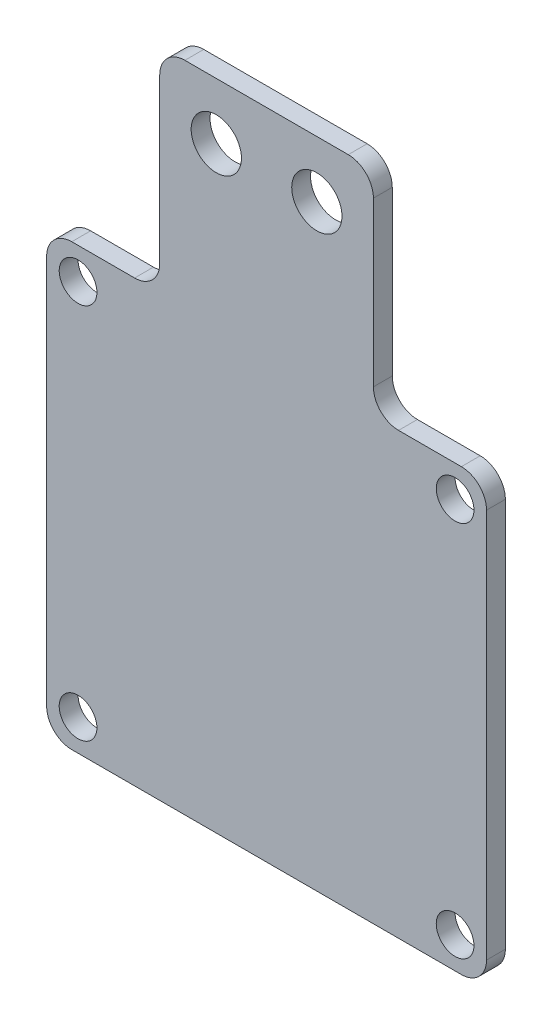
ISO-10303-21;
HEADER;
FILE_DESCRIPTION(('STEP AP214'),'2;1');
FILE_NAME('part.step','',(''),(''),'','','');
FILE_SCHEMA(('AUTOMOTIVE_DESIGN { 1 0 10303 214 1 1 1 1 }'));
ENDSEC;
DATA;
#1=APPLICATION_CONTEXT('core data for automotive mechanical design processes');
#2=APPLICATION_PROTOCOL_DEFINITION('international standard','automotive_design',2000,#1);
#3=PRODUCT_CONTEXT('',#1,'mechanical');
#4=PRODUCT('Part','Part','',(#3));
#5=PRODUCT_RELATED_PRODUCT_CATEGORY('part','',(#4));
#6=PRODUCT_DEFINITION_FORMATION('','',#4);
#7=PRODUCT_DEFINITION_CONTEXT('part definition',#1,'design');
#8=PRODUCT_DEFINITION('design','',#6,#7);
#9=PRODUCT_DEFINITION_SHAPE('','',#8);
#10=(LENGTH_UNIT() NAMED_UNIT(*) SI_UNIT(.MILLI.,.METRE.));
#11=(NAMED_UNIT(*) PLANE_ANGLE_UNIT() SI_UNIT($,.RADIAN.));
#12=(NAMED_UNIT(*) SI_UNIT($,.STERADIAN.) SOLID_ANGLE_UNIT());
#13=UNCERTAINTY_MEASURE_WITH_UNIT(LENGTH_MEASURE(1.E-05),#10,'distance_accuracy_value','');
#14=(GEOMETRIC_REPRESENTATION_CONTEXT(3) GLOBAL_UNCERTAINTY_ASSIGNED_CONTEXT((#13)) GLOBAL_UNIT_ASSIGNED_CONTEXT((#10,
#11,#12)) REPRESENTATION_CONTEXT('',''));
#15=CARTESIAN_POINT('',(0.,0.,0.));
#16=DIRECTION('',(0.,0.,1.));
#17=DIRECTION('',(1.,0.,0.));
#18=AXIS2_PLACEMENT_3D('',#15,#16,#17);
#19=CARTESIAN_POINT('',(10.5,37.,1.5));
#20=DIRECTION('',(0.,0.,1.));
#21=DIRECTION('',(1.,0.,0.));
#22=AXIS2_PLACEMENT_3D('',#19,#20,#21);
#23=PLANE('',#22);
#24=CARTESIAN_POINT('',(15.,32.5,1.5));
#25=DIRECTION('',(0.,0.,1.));
#26=DIRECTION('',(-1.,0.,0.));
#27=AXIS2_PLACEMENT_3D('',#24,#25,#26);
#28=CIRCLE('',#27,1.5);
#29=CARTESIAN_POINT('',(13.5,32.5,1.5));
#30=VERTEX_POINT('',#29);
#31=EDGE_CURVE('E353',#30,#30,#28,.T.);
#32=ORIENTED_EDGE('',*,*,#31,.F.);
#33=EDGE_LOOP('',(#32));
#34=FACE_BOUND('',#33,.T.);
#35=CARTESIAN_POINT('',(-4.,47.5,1.5));
#36=DIRECTION('',(0.,0.,1.));
#37=DIRECTION('',(1.,0.,0.));
#38=AXIS2_PLACEMENT_3D('',#35,#36,#37);
#39=CIRCLE('',#38,2.);
#40=CARTESIAN_POINT('',(-1.99999999999999,47.5,1.5));
#41=VERTEX_POINT('',#40);
#42=EDGE_CURVE('E365',#41,#41,#39,.T.);
#43=ORIENTED_EDGE('',*,*,#42,.F.);
#44=EDGE_LOOP('',(#43));
#45=FACE_BOUND('',#44,.T.);
#46=CARTESIAN_POINT('',(-15.,2.5,1.5));
#47=DIRECTION('',(0.,0.,1.));
#48=DIRECTION('',(1.,0.,0.));
#49=AXIS2_PLACEMENT_3D('',#46,#47,#48);
#50=CIRCLE('',#49,1.5);
#51=CARTESIAN_POINT('',(-13.5,2.5,1.5));
#52=VERTEX_POINT('',#51);
#53=EDGE_CURVE('E184',#52,#52,#50,.T.);
#54=ORIENTED_EDGE('',*,*,#53,.F.);
#55=EDGE_LOOP('',(#54));
#56=FACE_BOUND('',#55,.T.);
#57=CARTESIAN_POINT('',(10.5,37.,1.5));
#58=DIRECTION('',(0.,0.,-1.));
#59=DIRECTION('',(1.,0.,0.));
#60=AXIS2_PLACEMENT_3D('',#57,#58,#59);
#61=CIRCLE('',#60,2.);
#62=CARTESIAN_POINT('',(10.5,35.,1.5));
#63=VERTEX_POINT('',#62);
#64=CARTESIAN_POINT('',(8.5,37.,1.5));
#65=VERTEX_POINT('',#64);
#66=EDGE_CURVE('E213',#63,#65,#61,.T.);
#67=ORIENTED_EDGE('',*,*,#66,.T.);
#68=DIRECTION('',(0.,1.,0.));
#69=VECTOR('',#68,1.);
#70=CARTESIAN_POINT('',(8.5,37.,1.5));
#71=LINE('',#70,#69);
#72=CARTESIAN_POINT('',(8.5,50.,1.5));
#73=VERTEX_POINT('',#72);
#74=EDGE_CURVE('E119',#65,#73,#71,.T.);
#75=ORIENTED_EDGE('',*,*,#74,.T.);
#76=CARTESIAN_POINT('',(6.5,50.,1.5));
#77=DIRECTION('',(0.,0.,1.));
#78=DIRECTION('',(1.,0.,0.));
#79=AXIS2_PLACEMENT_3D('',#76,#77,#78);
#80=CIRCLE('',#79,2.);
#81=CARTESIAN_POINT('',(6.5,52.,1.5));
#82=VERTEX_POINT('',#81);
#83=EDGE_CURVE('E252',#73,#82,#80,.T.);
#84=ORIENTED_EDGE('',*,*,#83,.T.);
#85=DIRECTION('',(-1.,0.,0.));
#86=VECTOR('',#85,1.);
#87=CARTESIAN_POINT('',(6.5,52.,1.5));
#88=LINE('',#87,#86);
#89=CARTESIAN_POINT('',(-6.5,52.,1.5));
#90=VERTEX_POINT('',#89);
#91=EDGE_CURVE('E270',#82,#90,#88,.T.);
#92=ORIENTED_EDGE('',*,*,#91,.T.);
#93=CARTESIAN_POINT('',(-6.5,50.,1.5));
#94=DIRECTION('',(0.,0.,1.));
#95=DIRECTION('',(-1.,0.,0.));
#96=AXIS2_PLACEMENT_3D('',#93,#94,#95);
#97=CIRCLE('',#96,2.);
#98=CARTESIAN_POINT('',(-8.5,50.,1.5));
#99=VERTEX_POINT('',#98);
#100=EDGE_CURVE('E267',#90,#99,#97,.T.);
#101=ORIENTED_EDGE('',*,*,#100,.T.);
#102=DIRECTION('',(0.,-1.,0.));
#103=VECTOR('',#102,1.);
#104=CARTESIAN_POINT('',(-8.5,37.,1.5));
#105=LINE('',#104,#103);
#106=CARTESIAN_POINT('',(-8.5,37.,1.5));
#107=VERTEX_POINT('',#106);
#108=EDGE_CURVE('E269',#99,#107,#105,.T.);
#109=ORIENTED_EDGE('',*,*,#108,.T.);
#110=CARTESIAN_POINT('',(-10.5,37.,1.5));
#111=DIRECTION('',(0.,0.,-1.));
#112=DIRECTION('',(-1.,0.,0.));
#113=AXIS2_PLACEMENT_3D('',#110,#111,#112);
#114=CIRCLE('',#113,2.);
#115=CARTESIAN_POINT('',(-10.5,35.,1.5));
#116=VERTEX_POINT('',#115);
#117=EDGE_CURVE('E272',#107,#116,#114,.T.);
#118=ORIENTED_EDGE('',*,*,#117,.T.);
#119=DIRECTION('',(-1.,0.,0.));
#120=VECTOR('',#119,1.);
#121=CARTESIAN_POINT('',(-15.5,35.,1.5));
#122=LINE('',#121,#120);
#123=CARTESIAN_POINT('',(-15.5,35.,1.5));
#124=VERTEX_POINT('',#123);
#125=EDGE_CURVE('E278',#116,#124,#122,.T.);
#126=ORIENTED_EDGE('',*,*,#125,.T.);
#127=CARTESIAN_POINT('',(-15.5,33.,1.5));
#128=DIRECTION('',(0.,0.,1.));
#129=DIRECTION('',(-1.,0.,0.));
#130=AXIS2_PLACEMENT_3D('',#127,#128,#129);
#131=CIRCLE('',#130,2.);
#132=CARTESIAN_POINT('',(-17.5,33.,1.5));
#133=VERTEX_POINT('',#132);
#134=EDGE_CURVE('E280',#124,#133,#131,.T.);
#135=ORIENTED_EDGE('',*,*,#134,.T.);
#136=DIRECTION('',(0.,-1.,0.));
#137=VECTOR('',#136,1.);
#138=CARTESIAN_POINT('',(-17.5,2.,1.5));
#139=LINE('',#138,#137);
#140=CARTESIAN_POINT('',(-17.5,2.,1.5));
#141=VERTEX_POINT('',#140);
#142=EDGE_CURVE('E282',#133,#141,#139,.T.);
#143=ORIENTED_EDGE('',*,*,#142,.T.);
#144=CARTESIAN_POINT('',(-15.5,2.,1.5));
#145=DIRECTION('',(0.,0.,1.));
#146=DIRECTION('',(-1.,0.,0.));
#147=AXIS2_PLACEMENT_3D('',#144,#145,#146);
#148=CIRCLE('',#147,2.);
#149=CARTESIAN_POINT('',(-15.5,0.,1.5));
#150=VERTEX_POINT('',#149);
#151=EDGE_CURVE('E284',#141,#150,#148,.T.);
#152=ORIENTED_EDGE('',*,*,#151,.T.);
#153=DIRECTION('',(1.,0.,0.));
#154=VECTOR('',#153,1.);
#155=CARTESIAN_POINT('',(0.,0.,1.5));
#156=LINE('',#155,#154);
#157=CARTESIAN_POINT('',(15.5,0.,1.5));
#158=VERTEX_POINT('',#157);
#159=EDGE_CURVE('E286',#150,#158,#156,.T.);
#160=ORIENTED_EDGE('',*,*,#159,.T.);
#161=CARTESIAN_POINT('',(15.5,2.,1.5));
#162=DIRECTION('',(0.,0.,1.));
#163=DIRECTION('',(1.,0.,0.));
#164=AXIS2_PLACEMENT_3D('',#161,#162,#163);
#165=CIRCLE('',#164,2.);
#166=CARTESIAN_POINT('',(17.5,2.,1.5));
#167=VERTEX_POINT('',#166);
#168=EDGE_CURVE('E162',#158,#167,#165,.T.);
#169=ORIENTED_EDGE('',*,*,#168,.T.);
#170=DIRECTION('',(0.,1.,0.));
#171=VECTOR('',#170,1.);
#172=CARTESIAN_POINT('',(17.5,2.,1.5));
#173=LINE('',#172,#171);
#174=CARTESIAN_POINT('',(17.5,33.,1.5));
#175=VERTEX_POINT('',#174);
#176=EDGE_CURVE('E156',#167,#175,#173,.T.);
#177=ORIENTED_EDGE('',*,*,#176,.T.);
#178=CARTESIAN_POINT('',(15.5,33.,1.5));
#179=DIRECTION('',(0.,0.,1.));
#180=DIRECTION('',(1.,0.,0.));
#181=AXIS2_PLACEMENT_3D('',#178,#179,#180);
#182=CIRCLE('',#181,2.);
#183=CARTESIAN_POINT('',(15.5,35.,1.5));
#184=VERTEX_POINT('',#183);
#185=EDGE_CURVE('E160',#175,#184,#182,.T.);
#186=ORIENTED_EDGE('',*,*,#185,.T.);
#187=DIRECTION('',(-1.,0.,0.));
#188=VECTOR('',#187,1.);
#189=CARTESIAN_POINT('',(15.5,35.,1.5));
#190=LINE('',#189,#188);
#191=EDGE_CURVE('E52',#184,#63,#190,.T.);
#192=ORIENTED_EDGE('',*,*,#191,.T.);
#193=EDGE_LOOP('',(#67,#75,#84,#92,#101,#109,#118,#126,#135,#143,#152,#160,#169,#177,#186,#192));
#194=FACE_BOUND('',#193,.T.);
#195=CARTESIAN_POINT('',(-15.,32.5,1.5));
#196=DIRECTION('',(0.,0.,1.));
#197=DIRECTION('',(1.,0.,0.));
#198=AXIS2_PLACEMENT_3D('',#195,#196,#197);
#199=CIRCLE('',#198,1.5);
#200=CARTESIAN_POINT('',(-13.5,32.5,1.5));
#201=VERTEX_POINT('',#200);
#202=EDGE_CURVE('E371',#201,#201,#199,.T.);
#203=ORIENTED_EDGE('',*,*,#202,.F.);
#204=EDGE_LOOP('',(#203));
#205=FACE_BOUND('',#204,.T.);
#206=CARTESIAN_POINT('',(4.,47.5,1.5));
#207=DIRECTION('',(0.,0.,1.));
#208=DIRECTION('',(-1.,0.,0.));
#209=AXIS2_PLACEMENT_3D('',#206,#207,#208);
#210=CIRCLE('',#209,2.);
#211=CARTESIAN_POINT('',(1.99999999999999,47.5,1.5));
#212=VERTEX_POINT('',#211);
#213=EDGE_CURVE('E359',#212,#212,#210,.T.);
#214=ORIENTED_EDGE('',*,*,#213,.F.);
#215=EDGE_LOOP('',(#214));
#216=FACE_BOUND('',#215,.T.);
#217=CARTESIAN_POINT('',(15.,2.5,1.5));
#218=DIRECTION('',(0.,0.,1.));
#219=DIRECTION('',(-1.,0.,0.));
#220=AXIS2_PLACEMENT_3D('',#217,#218,#219);
#221=CIRCLE('',#220,1.5);
#222=CARTESIAN_POINT('',(13.5,2.5,1.5));
#223=VERTEX_POINT('',#222);
#224=EDGE_CURVE('E344',#223,#223,#221,.T.);
#225=ORIENTED_EDGE('',*,*,#224,.F.);
#226=EDGE_LOOP('',(#225));
#227=FACE_BOUND('',#226,.T.);
#228=ADVANCED_FACE('F35',(#34,#45,#56,#194,#205,#216,#227),#23,.T.);
#229=CARTESIAN_POINT('',(10.5,37.,0.));
#230=DIRECTION('',(0.,0.,1.));
#231=DIRECTION('',(1.,0.,0.));
#232=AXIS2_PLACEMENT_3D('',#229,#230,#231);
#233=PLANE('',#232);
#234=CARTESIAN_POINT('',(10.5,37.,0.));
#235=DIRECTION('',(0.,0.,-1.));
#236=DIRECTION('',(1.,0.,0.));
#237=AXIS2_PLACEMENT_3D('',#234,#235,#236);
#238=CIRCLE('',#237,2.);
#239=CARTESIAN_POINT('',(10.5,35.,0.));
#240=VERTEX_POINT('',#239);
#241=CARTESIAN_POINT('',(8.5,37.,0.));
#242=VERTEX_POINT('',#241);
#243=EDGE_CURVE('E180',#240,#242,#238,.T.);
#244=ORIENTED_EDGE('',*,*,#243,.F.);
#245=DIRECTION('',(-1.,0.,0.));
#246=VECTOR('',#245,1.);
#247=CARTESIAN_POINT('',(15.5,35.,0.));
#248=LINE('',#247,#246);
#249=CARTESIAN_POINT('',(15.5,35.,0.));
#250=VERTEX_POINT('',#249);
#251=EDGE_CURVE('E111',#250,#240,#248,.T.);
#252=ORIENTED_EDGE('',*,*,#251,.F.);
#253=CARTESIAN_POINT('',(15.5,33.,0.));
#254=DIRECTION('',(0.,0.,1.));
#255=DIRECTION('',(1.,0.,0.));
#256=AXIS2_PLACEMENT_3D('',#253,#254,#255);
#257=CIRCLE('',#256,2.);
#258=CARTESIAN_POINT('',(17.5,33.,0.));
#259=VERTEX_POINT('',#258);
#260=EDGE_CURVE('E105',#259,#250,#257,.T.);
#261=ORIENTED_EDGE('',*,*,#260,.F.);
#262=DIRECTION('',(0.,1.,0.));
#263=VECTOR('',#262,1.);
#264=CARTESIAN_POINT('',(17.5,2.,0.));
#265=LINE('',#264,#263);
#266=CARTESIAN_POINT('',(17.5,2.,0.));
#267=VERTEX_POINT('',#266);
#268=EDGE_CURVE('E170',#267,#259,#265,.T.);
#269=ORIENTED_EDGE('',*,*,#268,.F.);
#270=CARTESIAN_POINT('',(15.5,2.,0.));
#271=DIRECTION('',(0.,0.,1.));
#272=DIRECTION('',(1.,0.,0.));
#273=AXIS2_PLACEMENT_3D('',#270,#271,#272);
#274=CIRCLE('',#273,2.);
#275=CARTESIAN_POINT('',(15.5,0.,0.));
#276=VERTEX_POINT('',#275);
#277=EDGE_CURVE('E208',#276,#267,#274,.T.);
#278=ORIENTED_EDGE('',*,*,#277,.F.);
#279=DIRECTION('',(1.,0.,0.));
#280=VECTOR('',#279,1.);
#281=CARTESIAN_POINT('',(0.,0.,0.));
#282=LINE('',#281,#280);
#283=CARTESIAN_POINT('',(-15.5,0.,0.));
#284=VERTEX_POINT('',#283);
#285=EDGE_CURVE('E206',#284,#276,#282,.T.);
#286=ORIENTED_EDGE('',*,*,#285,.F.);
#287=CARTESIAN_POINT('',(-15.5,2.,0.));
#288=DIRECTION('',(0.,0.,1.));
#289=DIRECTION('',(-1.,0.,0.));
#290=AXIS2_PLACEMENT_3D('',#287,#288,#289);
#291=CIRCLE('',#290,2.);
#292=CARTESIAN_POINT('',(-17.5,2.,0.));
#293=VERTEX_POINT('',#292);
#294=EDGE_CURVE('E203',#293,#284,#291,.T.);
#295=ORIENTED_EDGE('',*,*,#294,.F.);
#296=DIRECTION('',(0.,-1.,0.));
#297=VECTOR('',#296,1.);
#298=CARTESIAN_POINT('',(-17.5,2.,0.));
#299=LINE('',#298,#297);
#300=CARTESIAN_POINT('',(-17.5,33.,0.));
#301=VERTEX_POINT('',#300);
#302=EDGE_CURVE('E201',#301,#293,#299,.T.);
#303=ORIENTED_EDGE('',*,*,#302,.F.);
#304=CARTESIAN_POINT('',(-15.5,33.,0.));
#305=DIRECTION('',(0.,0.,1.));
#306=DIRECTION('',(-1.,0.,0.));
#307=AXIS2_PLACEMENT_3D('',#304,#305,#306);
#308=CIRCLE('',#307,2.);
#309=CARTESIAN_POINT('',(-15.5,35.,0.));
#310=VERTEX_POINT('',#309);
#311=EDGE_CURVE('E199',#310,#301,#308,.T.);
#312=ORIENTED_EDGE('',*,*,#311,.F.);
#313=DIRECTION('',(-1.,0.,0.));
#314=VECTOR('',#313,1.);
#315=CARTESIAN_POINT('',(-15.5,35.,0.));
#316=LINE('',#315,#314);
#317=CARTESIAN_POINT('',(-10.5,35.,0.));
#318=VERTEX_POINT('',#317);
#319=EDGE_CURVE('E197',#318,#310,#316,.T.);
#320=ORIENTED_EDGE('',*,*,#319,.F.);
#321=CARTESIAN_POINT('',(-10.5,37.,0.));
#322=DIRECTION('',(0.,0.,-1.));
#323=DIRECTION('',(-1.,0.,0.));
#324=AXIS2_PLACEMENT_3D('',#321,#322,#323);
#325=CIRCLE('',#324,2.);
#326=CARTESIAN_POINT('',(-8.5,37.,0.));
#327=VERTEX_POINT('',#326);
#328=EDGE_CURVE('E195',#327,#318,#325,.T.);
#329=ORIENTED_EDGE('',*,*,#328,.F.);
#330=DIRECTION('',(0.,-1.,0.));
#331=VECTOR('',#330,1.);
#332=CARTESIAN_POINT('',(-8.5,37.,0.));
#333=LINE('',#332,#331);
#334=CARTESIAN_POINT('',(-8.5,50.,0.));
#335=VERTEX_POINT('',#334);
#336=EDGE_CURVE('E193',#335,#327,#333,.T.);
#337=ORIENTED_EDGE('',*,*,#336,.F.);
#338=CARTESIAN_POINT('',(-6.5,50.,0.));
#339=DIRECTION('',(0.,0.,1.));
#340=DIRECTION('',(-1.,0.,0.));
#341=AXIS2_PLACEMENT_3D('',#338,#339,#340);
#342=CIRCLE('',#341,2.);
#343=CARTESIAN_POINT('',(-6.5,52.,0.));
#344=VERTEX_POINT('',#343);
#345=EDGE_CURVE('E191',#344,#335,#342,.T.);
#346=ORIENTED_EDGE('',*,*,#345,.F.);
#347=DIRECTION('',(-1.,0.,0.));
#348=VECTOR('',#347,1.);
#349=CARTESIAN_POINT('',(-6.5,52.,0.));
#350=LINE('',#349,#348);
#351=CARTESIAN_POINT('',(6.5,52.,0.));
#352=VERTEX_POINT('',#351);
#353=EDGE_CURVE('E189',#352,#344,#350,.T.);
#354=ORIENTED_EDGE('',*,*,#353,.F.);
#355=CARTESIAN_POINT('',(6.5,50.,0.));
#356=DIRECTION('',(0.,0.,1.));
#357=DIRECTION('',(1.,0.,0.));
#358=AXIS2_PLACEMENT_3D('',#355,#356,#357);
#359=CIRCLE('',#358,2.);
#360=CARTESIAN_POINT('',(8.5,50.,0.));
#361=VERTEX_POINT('',#360);
#362=EDGE_CURVE('E186',#361,#352,#359,.T.);
#363=ORIENTED_EDGE('',*,*,#362,.F.);
#364=DIRECTION('',(0.,1.,0.));
#365=VECTOR('',#364,1.);
#366=CARTESIAN_POINT('',(8.5,37.,0.));
#367=LINE('',#366,#365);
#368=EDGE_CURVE('E183',#242,#361,#367,.T.);
#369=ORIENTED_EDGE('',*,*,#368,.F.);
#370=EDGE_LOOP('',(#244,#252,#261,#269,#278,#286,#295,#303,#312,#320,#329,#337,#346,#354,#363,#369));
#371=FACE_BOUND('',#370,.T.);
#372=CARTESIAN_POINT('',(-15.,2.5,0.));
#373=DIRECTION('',(0.,0.,1.));
#374=DIRECTION('',(1.,0.,0.));
#375=AXIS2_PLACEMENT_3D('',#372,#373,#374);
#376=CIRCLE('',#375,1.5);
#377=CARTESIAN_POINT('',(-13.5,2.5,0.));
#378=VERTEX_POINT('',#377);
#379=EDGE_CURVE('E374',#378,#378,#376,.T.);
#380=ORIENTED_EDGE('',*,*,#379,.T.);
#381=EDGE_LOOP('',(#380));
#382=FACE_BOUND('',#381,.T.);
#383=CARTESIAN_POINT('',(-15.,32.5,0.));
#384=DIRECTION('',(0.,0.,1.));
#385=DIRECTION('',(1.,0.,0.));
#386=AXIS2_PLACEMENT_3D('',#383,#384,#385);
#387=CIRCLE('',#386,1.5);
#388=CARTESIAN_POINT('',(-13.5,32.5,0.));
#389=VERTEX_POINT('',#388);
#390=EDGE_CURVE('E368',#389,#389,#387,.T.);
#391=ORIENTED_EDGE('',*,*,#390,.T.);
#392=EDGE_LOOP('',(#391));
#393=FACE_BOUND('',#392,.T.);
#394=CARTESIAN_POINT('',(-4.,47.5,0.));
#395=DIRECTION('',(0.,0.,1.));
#396=DIRECTION('',(1.,0.,0.));
#397=AXIS2_PLACEMENT_3D('',#394,#395,#396);
#398=CIRCLE('',#397,2.);
#399=CARTESIAN_POINT('',(-1.99999999999999,47.5,0.));
#400=VERTEX_POINT('',#399);
#401=EDGE_CURVE('E362',#400,#400,#398,.T.);
#402=ORIENTED_EDGE('',*,*,#401,.T.);
#403=EDGE_LOOP('',(#402));
#404=FACE_BOUND('',#403,.T.);
#405=CARTESIAN_POINT('',(4.,47.5,0.));
#406=DIRECTION('',(0.,0.,1.));
#407=DIRECTION('',(-1.,0.,0.));
#408=AXIS2_PLACEMENT_3D('',#405,#406,#407);
#409=CIRCLE('',#408,2.);
#410=CARTESIAN_POINT('',(1.99999999999999,47.5,0.));
#411=VERTEX_POINT('',#410);
#412=EDGE_CURVE('E356',#411,#411,#409,.T.);
#413=ORIENTED_EDGE('',*,*,#412,.T.);
#414=EDGE_LOOP('',(#413));
#415=FACE_BOUND('',#414,.T.);
#416=CARTESIAN_POINT('',(15.,32.5,0.));
#417=DIRECTION('',(0.,0.,1.));
#418=DIRECTION('',(-1.,0.,0.));
#419=AXIS2_PLACEMENT_3D('',#416,#417,#418);
#420=CIRCLE('',#419,1.5);
#421=CARTESIAN_POINT('',(13.5,32.5,0.));
#422=VERTEX_POINT('',#421);
#423=EDGE_CURVE('E350',#422,#422,#420,.T.);
#424=ORIENTED_EDGE('',*,*,#423,.T.);
#425=EDGE_LOOP('',(#424));
#426=FACE_BOUND('',#425,.T.);
#427=CARTESIAN_POINT('',(15.,2.5,0.));
#428=DIRECTION('',(0.,0.,1.));
#429=DIRECTION('',(-1.,0.,0.));
#430=AXIS2_PLACEMENT_3D('',#427,#428,#429);
#431=CIRCLE('',#430,1.5);
#432=CARTESIAN_POINT('',(13.5,2.5,0.));
#433=VERTEX_POINT('',#432);
#434=EDGE_CURVE('E347',#433,#433,#431,.T.);
#435=ORIENTED_EDGE('',*,*,#434,.T.);
#436=EDGE_LOOP('',(#435));
#437=FACE_BOUND('',#436,.T.);
#438=ADVANCED_FACE('F255',(#371,#382,#393,#404,#415,#426,#437),#233,.F.);
#439=CARTESIAN_POINT('',(10.5,37.,1.5));
#440=DIRECTION('',(0.,0.,-1.));
#441=DIRECTION('',(-1.,0.,0.));
#442=AXIS2_PLACEMENT_3D('',#439,#440,#441);
#443=CYLINDRICAL_SURFACE('',#442,2.);
#444=ORIENTED_EDGE('',*,*,#243,.T.);
#445=DIRECTION('',(0.,0.,-1.));
#446=VECTOR('',#445,1.);
#447=CARTESIAN_POINT('',(8.5,37.,1.5));
#448=LINE('',#447,#446);
#449=EDGE_CURVE('E11',#65,#242,#448,.T.);
#450=ORIENTED_EDGE('',*,*,#449,.F.);
#451=ORIENTED_EDGE('',*,*,#66,.F.);
#452=DIRECTION('',(0.,0.,-1.));
#453=VECTOR('',#452,1.);
#454=CARTESIAN_POINT('',(10.5,35.,1.5));
#455=LINE('',#454,#453);
#456=EDGE_CURVE('E176',#63,#240,#455,.T.);
#457=ORIENTED_EDGE('',*,*,#456,.T.);
#458=EDGE_LOOP('',(#444,#450,#451,#457));
#459=FACE_BOUND('',#458,.T.);
#460=ADVANCED_FACE('F37',(#459),#443,.F.);
#461=CARTESIAN_POINT('',(8.5,37.,1.5));
#462=DIRECTION('',(-1.,0.,0.));
#463=DIRECTION('',(0.,-1.,0.));
#464=AXIS2_PLACEMENT_3D('',#461,#462,#463);
#465=PLANE('',#464);
#466=ORIENTED_EDGE('',*,*,#368,.T.);
#467=DIRECTION('',(0.,0.,-1.));
#468=VECTOR('',#467,1.);
#469=CARTESIAN_POINT('',(8.5,50.,1.5));
#470=LINE('',#469,#468);
#471=EDGE_CURVE('E44',#73,#361,#470,.T.);
#472=ORIENTED_EDGE('',*,*,#471,.F.);
#473=ORIENTED_EDGE('',*,*,#74,.F.);
#474=ORIENTED_EDGE('',*,*,#449,.T.);
#475=EDGE_LOOP('',(#466,#472,#473,#474));
#476=FACE_BOUND('',#475,.T.);
#477=ADVANCED_FACE('F544',(#476),#465,.F.);
#478=CARTESIAN_POINT('',(6.5,50.,1.5));
#479=DIRECTION('',(0.,0.,-1.));
#480=DIRECTION('',(-1.,0.,0.));
#481=AXIS2_PLACEMENT_3D('',#478,#479,#480);
#482=CYLINDRICAL_SURFACE('',#481,2.);
#483=ORIENTED_EDGE('',*,*,#362,.T.);
#484=DIRECTION('',(0.,0.,-1.));
#485=VECTOR('',#484,1.);
#486=CARTESIAN_POINT('',(6.5,52.,1.5));
#487=LINE('',#486,#485);
#488=EDGE_CURVE('E244',#82,#352,#487,.T.);
#489=ORIENTED_EDGE('',*,*,#488,.F.);
#490=ORIENTED_EDGE('',*,*,#83,.F.);
#491=ORIENTED_EDGE('',*,*,#471,.T.);
#492=EDGE_LOOP('',(#483,#489,#490,#491));
#493=FACE_BOUND('',#492,.T.);
#494=ADVANCED_FACE('F250',(#493),#482,.T.);
#495=CARTESIAN_POINT('',(-6.5,52.,1.5));
#496=DIRECTION('',(0.,-1.,0.));
#497=DIRECTION('',(1.,0.,0.));
#498=AXIS2_PLACEMENT_3D('',#495,#496,#497);
#499=PLANE('',#498);
#500=ORIENTED_EDGE('',*,*,#353,.T.);
#501=DIRECTION('',(0.,0.,-1.));
#502=VECTOR('',#501,1.);
#503=CARTESIAN_POINT('',(-6.5,52.,1.5));
#504=LINE('',#503,#502);
#505=EDGE_CURVE('E241',#90,#344,#504,.T.);
#506=ORIENTED_EDGE('',*,*,#505,.F.);
#507=ORIENTED_EDGE('',*,*,#91,.F.);
#508=ORIENTED_EDGE('',*,*,#488,.T.);
#509=EDGE_LOOP('',(#500,#506,#507,#508));
#510=FACE_BOUND('',#509,.T.);
#511=ADVANCED_FACE('F261',(#510),#499,.F.);
#512=CARTESIAN_POINT('',(-6.5,50.,1.5));
#513=DIRECTION('',(0.,0.,-1.));
#514=DIRECTION('',(-1.,0.,0.));
#515=AXIS2_PLACEMENT_3D('',#512,#513,#514);
#516=CYLINDRICAL_SURFACE('',#515,2.);
#517=ORIENTED_EDGE('',*,*,#345,.T.);
#518=DIRECTION('',(0.,0.,-1.));
#519=VECTOR('',#518,1.);
#520=CARTESIAN_POINT('',(-8.5,50.,1.5));
#521=LINE('',#520,#519);
#522=EDGE_CURVE('E238',#99,#335,#521,.T.);
#523=ORIENTED_EDGE('',*,*,#522,.F.);
#524=ORIENTED_EDGE('',*,*,#100,.F.);
#525=ORIENTED_EDGE('',*,*,#505,.T.);
#526=EDGE_LOOP('',(#517,#523,#524,#525));
#527=FACE_BOUND('',#526,.T.);
#528=ADVANCED_FACE('F265',(#527),#516,.T.);
#529=CARTESIAN_POINT('',(-8.5,37.,1.5));
#530=DIRECTION('',(1.,0.,0.));
#531=DIRECTION('',(0.,1.,0.));
#532=AXIS2_PLACEMENT_3D('',#529,#530,#531);
#533=PLANE('',#532);
#534=ORIENTED_EDGE('',*,*,#336,.T.);
#535=DIRECTION('',(0.,0.,-1.));
#536=VECTOR('',#535,1.);
#537=CARTESIAN_POINT('',(-8.5,37.,1.5));
#538=LINE('',#537,#536);
#539=EDGE_CURVE('E235',#107,#327,#538,.T.);
#540=ORIENTED_EDGE('',*,*,#539,.F.);
#541=ORIENTED_EDGE('',*,*,#108,.F.);
#542=ORIENTED_EDGE('',*,*,#522,.T.);
#543=EDGE_LOOP('',(#534,#540,#541,#542));
#544=FACE_BOUND('',#543,.T.);
#545=ADVANCED_FACE('F508',(#544),#533,.F.);
#546=CARTESIAN_POINT('',(-10.5,37.,1.5));
#547=DIRECTION('',(0.,0.,-1.));
#548=DIRECTION('',(-1.,0.,0.));
#549=AXIS2_PLACEMENT_3D('',#546,#547,#548);
#550=CYLINDRICAL_SURFACE('',#549,2.);
#551=ORIENTED_EDGE('',*,*,#328,.T.);
#552=DIRECTION('',(0.,0.,-1.));
#553=VECTOR('',#552,1.);
#554=CARTESIAN_POINT('',(-10.5,35.,1.5));
#555=LINE('',#554,#553);
#556=EDGE_CURVE('E232',#116,#318,#555,.T.);
#557=ORIENTED_EDGE('',*,*,#556,.F.);
#558=ORIENTED_EDGE('',*,*,#117,.F.);
#559=ORIENTED_EDGE('',*,*,#539,.T.);
#560=EDGE_LOOP('',(#551,#557,#558,#559));
#561=FACE_BOUND('',#560,.T.);
#562=ADVANCED_FACE('F498',(#561),#550,.F.);
#563=CARTESIAN_POINT('',(-15.5,35.,1.5));
#564=DIRECTION('',(0.,-1.,0.));
#565=DIRECTION('',(0.,0.,-1.));
#566=AXIS2_PLACEMENT_3D('',#563,#564,#565);
#567=PLANE('',#566);
#568=ORIENTED_EDGE('',*,*,#319,.T.);
#569=DIRECTION('',(0.,0.,-1.));
#570=VECTOR('',#569,1.);
#571=CARTESIAN_POINT('',(-15.5,35.,1.5));
#572=LINE('',#571,#570);
#573=EDGE_CURVE('E229',#124,#310,#572,.T.);
#574=ORIENTED_EDGE('',*,*,#573,.F.);
#575=ORIENTED_EDGE('',*,*,#125,.F.);
#576=ORIENTED_EDGE('',*,*,#556,.T.);
#577=EDGE_LOOP('',(#568,#574,#575,#576));
#578=FACE_BOUND('',#577,.T.);
#579=ADVANCED_FACE('F488',(#578),#567,.F.);
#580=CARTESIAN_POINT('',(-15.5,33.,1.5));
#581=DIRECTION('',(0.,0.,-1.));
#582=DIRECTION('',(-1.,0.,0.));
#583=AXIS2_PLACEMENT_3D('',#580,#581,#582);
#584=CYLINDRICAL_SURFACE('',#583,2.);
#585=ORIENTED_EDGE('',*,*,#311,.T.);
#586=DIRECTION('',(0.,0.,-1.));
#587=VECTOR('',#586,1.);
#588=CARTESIAN_POINT('',(-17.5,33.,1.5));
#589=LINE('',#588,#587);
#590=EDGE_CURVE('E226',#133,#301,#589,.T.);
#591=ORIENTED_EDGE('',*,*,#590,.F.);
#592=ORIENTED_EDGE('',*,*,#134,.F.);
#593=ORIENTED_EDGE('',*,*,#573,.T.);
#594=EDGE_LOOP('',(#585,#591,#592,#593));
#595=FACE_BOUND('',#594,.T.);
#596=ADVANCED_FACE('F478',(#595),#584,.T.);
#597=CARTESIAN_POINT('',(-17.5,2.,1.5));
#598=DIRECTION('',(1.,0.,0.));
#599=DIRECTION('',(0.,0.,-1.));
#600=AXIS2_PLACEMENT_3D('',#597,#598,#599);
#601=PLANE('',#600);
#602=ORIENTED_EDGE('',*,*,#302,.T.);
#603=DIRECTION('',(0.,0.,-1.));
#604=VECTOR('',#603,1.);
#605=CARTESIAN_POINT('',(-17.5,2.,1.5));
#606=LINE('',#605,#604);
#607=EDGE_CURVE('E223',#141,#293,#606,.T.);
#608=ORIENTED_EDGE('',*,*,#607,.F.);
#609=ORIENTED_EDGE('',*,*,#142,.F.);
#610=ORIENTED_EDGE('',*,*,#590,.T.);
#611=EDGE_LOOP('',(#602,#608,#609,#610));
#612=FACE_BOUND('',#611,.T.);
#613=ADVANCED_FACE('F468',(#612),#601,.F.);
#614=CARTESIAN_POINT('',(-15.5,2.,1.5));
#615=DIRECTION('',(0.,0.,-1.));
#616=DIRECTION('',(-1.,0.,0.));
#617=AXIS2_PLACEMENT_3D('',#614,#615,#616);
#618=CYLINDRICAL_SURFACE('',#617,2.);
#619=ORIENTED_EDGE('',*,*,#294,.T.);
#620=DIRECTION('',(0.,0.,-1.));
#621=VECTOR('',#620,1.);
#622=CARTESIAN_POINT('',(-15.5,0.,1.5));
#623=LINE('',#622,#621);
#624=EDGE_CURVE('E220',#150,#284,#623,.T.);
#625=ORIENTED_EDGE('',*,*,#624,.F.);
#626=ORIENTED_EDGE('',*,*,#151,.F.);
#627=ORIENTED_EDGE('',*,*,#607,.T.);
#628=EDGE_LOOP('',(#619,#625,#626,#627));
#629=FACE_BOUND('',#628,.T.);
#630=ADVANCED_FACE('F458',(#629),#618,.T.);
#631=CARTESIAN_POINT('',(0.,0.,1.5));
#632=DIRECTION('',(0.,1.,0.));
#633=DIRECTION('',(-1.,0.,0.));
#634=AXIS2_PLACEMENT_3D('',#631,#632,#633);
#635=PLANE('',#634);
#636=ORIENTED_EDGE('',*,*,#285,.T.);
#637=DIRECTION('',(0.,0.,-1.));
#638=VECTOR('',#637,1.);
#639=CARTESIAN_POINT('',(15.5,0.,1.5));
#640=LINE('',#639,#638);
#641=EDGE_CURVE('E217',#158,#276,#640,.T.);
#642=ORIENTED_EDGE('',*,*,#641,.F.);
#643=ORIENTED_EDGE('',*,*,#159,.F.);
#644=ORIENTED_EDGE('',*,*,#624,.T.);
#645=EDGE_LOOP('',(#636,#642,#643,#644));
#646=FACE_BOUND('',#645,.T.);
#647=ADVANCED_FACE('F292',(#646),#635,.F.);
#648=CARTESIAN_POINT('',(15.5,2.,1.5));
#649=DIRECTION('',(0.,0.,-1.));
#650=DIRECTION('',(-1.,0.,0.));
#651=AXIS2_PLACEMENT_3D('',#648,#649,#650);
#652=CYLINDRICAL_SURFACE('',#651,2.);
#653=ORIENTED_EDGE('',*,*,#277,.T.);
#654=DIRECTION('',(0.,0.,-1.));
#655=VECTOR('',#654,1.);
#656=CARTESIAN_POINT('',(17.5,2.,1.5));
#657=LINE('',#656,#655);
#658=EDGE_CURVE('E171',#167,#267,#657,.T.);
#659=ORIENTED_EDGE('',*,*,#658,.F.);
#660=ORIENTED_EDGE('',*,*,#168,.F.);
#661=ORIENTED_EDGE('',*,*,#641,.T.);
#662=EDGE_LOOP('',(#653,#659,#660,#661));
#663=FACE_BOUND('',#662,.T.);
#664=ADVANCED_FACE('F295',(#663),#652,.T.);
#665=CARTESIAN_POINT('',(17.5,2.,1.5));
#666=DIRECTION('',(-1.,0.,0.));
#667=DIRECTION('',(0.,0.,1.));
#668=AXIS2_PLACEMENT_3D('',#665,#666,#667);
#669=PLANE('',#668);
#670=ORIENTED_EDGE('',*,*,#268,.T.);
#671=DIRECTION('',(0.,0.,-1.));
#672=VECTOR('',#671,1.);
#673=CARTESIAN_POINT('',(17.5,33.,1.5));
#674=LINE('',#673,#672);
#675=EDGE_CURVE('E167',#175,#259,#674,.T.);
#676=ORIENTED_EDGE('',*,*,#675,.F.);
#677=ORIENTED_EDGE('',*,*,#176,.F.);
#678=ORIENTED_EDGE('',*,*,#658,.T.);
#679=EDGE_LOOP('',(#670,#676,#677,#678));
#680=FACE_BOUND('',#679,.T.);
#681=ADVANCED_FACE('F168',(#680),#669,.F.);
#682=CARTESIAN_POINT('',(15.5,33.,1.5));
#683=DIRECTION('',(0.,0.,-1.));
#684=DIRECTION('',(-1.,0.,0.));
#685=AXIS2_PLACEMENT_3D('',#682,#683,#684);
#686=CYLINDRICAL_SURFACE('',#685,2.);
#687=ORIENTED_EDGE('',*,*,#260,.T.);
#688=DIRECTION('',(0.,0.,-1.));
#689=VECTOR('',#688,1.);
#690=CARTESIAN_POINT('',(15.5,35.,1.5));
#691=LINE('',#690,#689);
#692=EDGE_CURVE('E172',#184,#250,#691,.T.);
#693=ORIENTED_EDGE('',*,*,#692,.F.);
#694=ORIENTED_EDGE('',*,*,#185,.F.);
#695=ORIENTED_EDGE('',*,*,#675,.T.);
#696=EDGE_LOOP('',(#687,#693,#694,#695));
#697=FACE_BOUND('',#696,.T.);
#698=ADVANCED_FACE('F174',(#697),#686,.T.);
#699=CARTESIAN_POINT('',(15.5,35.,1.5));
#700=DIRECTION('',(0.,-1.,0.));
#701=DIRECTION('',(0.,0.,-1.));
#702=AXIS2_PLACEMENT_3D('',#699,#700,#701);
#703=PLANE('',#702);
#704=ORIENTED_EDGE('',*,*,#251,.T.);
#705=ORIENTED_EDGE('',*,*,#456,.F.);
#706=ORIENTED_EDGE('',*,*,#191,.F.);
#707=ORIENTED_EDGE('',*,*,#692,.T.);
#708=EDGE_LOOP('',(#704,#705,#706,#707));
#709=FACE_BOUND('',#708,.T.);
#710=ADVANCED_FACE('F299',(#709),#703,.F.);
#711=CARTESIAN_POINT('',(-15.,2.5,1.5));
#712=DIRECTION('',(0.,0.,-1.));
#713=DIRECTION('',(-1.,0.,0.));
#714=AXIS2_PLACEMENT_3D('',#711,#712,#713);
#715=CYLINDRICAL_SURFACE('',#714,1.5);
#716=ORIENTED_EDGE('',*,*,#53,.T.);
#717=EDGE_LOOP('',(#716));
#718=FACE_BOUND('',#717,.T.);
#719=ORIENTED_EDGE('',*,*,#379,.F.);
#720=EDGE_LOOP('',(#719));
#721=FACE_BOUND('',#720,.T.);
#722=ADVANCED_FACE('F301',(#718,#721),#715,.F.);
#723=CARTESIAN_POINT('',(-15.,32.5,1.5));
#724=DIRECTION('',(0.,0.,-1.));
#725=DIRECTION('',(-1.,0.,0.));
#726=AXIS2_PLACEMENT_3D('',#723,#724,#725);
#727=CYLINDRICAL_SURFACE('',#726,1.5);
#728=ORIENTED_EDGE('',*,*,#202,.T.);
#729=EDGE_LOOP('',(#728));
#730=FACE_BOUND('',#729,.T.);
#731=ORIENTED_EDGE('',*,*,#390,.F.);
#732=EDGE_LOOP('',(#731));
#733=FACE_BOUND('',#732,.T.);
#734=ADVANCED_FACE('F307',(#730,#733),#727,.F.);
#735=CARTESIAN_POINT('',(-4.,47.5,1.5));
#736=DIRECTION('',(0.,0.,-1.));
#737=DIRECTION('',(-1.,0.,0.));
#738=AXIS2_PLACEMENT_3D('',#735,#736,#737);
#739=CYLINDRICAL_SURFACE('',#738,2.);
#740=ORIENTED_EDGE('',*,*,#42,.T.);
#741=EDGE_LOOP('',(#740));
#742=FACE_BOUND('',#741,.T.);
#743=ORIENTED_EDGE('',*,*,#401,.F.);
#744=EDGE_LOOP('',(#743));
#745=FACE_BOUND('',#744,.T.);
#746=ADVANCED_FACE('F323',(#742,#745),#739,.F.);
#747=CARTESIAN_POINT('',(4.,47.5,1.5));
#748=DIRECTION('',(0.,0.,-1.));
#749=DIRECTION('',(-1.,0.,0.));
#750=AXIS2_PLACEMENT_3D('',#747,#748,#749);
#751=CYLINDRICAL_SURFACE('',#750,2.);
#752=ORIENTED_EDGE('',*,*,#213,.T.);
#753=EDGE_LOOP('',(#752));
#754=FACE_BOUND('',#753,.T.);
#755=ORIENTED_EDGE('',*,*,#412,.F.);
#756=EDGE_LOOP('',(#755));
#757=FACE_BOUND('',#756,.T.);
#758=ADVANCED_FACE('F327',(#754,#757),#751,.F.);
#759=CARTESIAN_POINT('',(15.,32.5,1.5));
#760=DIRECTION('',(0.,0.,-1.));
#761=DIRECTION('',(-1.,0.,0.));
#762=AXIS2_PLACEMENT_3D('',#759,#760,#761);
#763=CYLINDRICAL_SURFACE('',#762,1.5);
#764=ORIENTED_EDGE('',*,*,#31,.T.);
#765=EDGE_LOOP('',(#764));
#766=FACE_BOUND('',#765,.T.);
#767=ORIENTED_EDGE('',*,*,#423,.F.);
#768=EDGE_LOOP('',(#767));
#769=FACE_BOUND('',#768,.T.);
#770=ADVANCED_FACE('F331',(#766,#769),#763,.F.);
#771=CARTESIAN_POINT('',(15.,2.5,1.5));
#772=DIRECTION('',(0.,0.,-1.));
#773=DIRECTION('',(-1.,0.,0.));
#774=AXIS2_PLACEMENT_3D('',#771,#772,#773);
#775=CYLINDRICAL_SURFACE('',#774,1.5);
#776=ORIENTED_EDGE('',*,*,#224,.T.);
#777=EDGE_LOOP('',(#776));
#778=FACE_BOUND('',#777,.T.);
#779=ORIENTED_EDGE('',*,*,#434,.F.);
#780=EDGE_LOOP('',(#779));
#781=FACE_BOUND('',#780,.T.);
#782=ADVANCED_FACE('F335',(#778,#781),#775,.F.);
#783=CLOSED_SHELL('',(#228,#438,#460,#477,#494,#511,#528,#545,#562,#579,#596,#613,#630,#647,
#664,#681,#698,#710,#722,#734,#746,#758,#770,#782));
#784=MANIFOLD_SOLID_BREP('B2',#783);
#785=ADVANCED_BREP_SHAPE_REPRESENTATION('',(#18,#784),#14);
#786=SHAPE_DEFINITION_REPRESENTATION(#9,#785);
ENDSEC;
END-ISO-10303-21;
